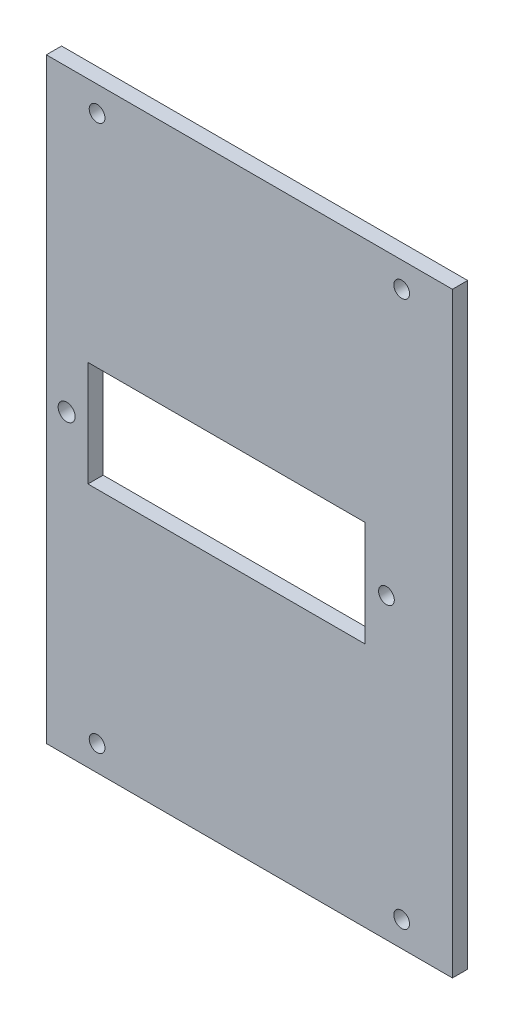
ISO-10303-21;
HEADER;
FILE_DESCRIPTION(('STEP AP214'),'2;1');
FILE_NAME('part.step','',(''),(''),'','','');
FILE_SCHEMA(('AUTOMOTIVE_DESIGN { 1 0 10303 214 1 1 1 1 }'));
ENDSEC;
DATA;
#1=APPLICATION_CONTEXT('core data for automotive mechanical design processes');
#2=APPLICATION_PROTOCOL_DEFINITION('international standard','automotive_design',2000,#1);
#3=PRODUCT_CONTEXT('',#1,'mechanical');
#4=PRODUCT('Part','Part','',(#3));
#5=PRODUCT_RELATED_PRODUCT_CATEGORY('part','',(#4));
#6=PRODUCT_DEFINITION_FORMATION('','',#4);
#7=PRODUCT_DEFINITION_CONTEXT('part definition',#1,'design');
#8=PRODUCT_DEFINITION('design','',#6,#7);
#9=PRODUCT_DEFINITION_SHAPE('','',#8);
#10=(LENGTH_UNIT() NAMED_UNIT(*) SI_UNIT(.MILLI.,.METRE.));
#11=(NAMED_UNIT(*) PLANE_ANGLE_UNIT() SI_UNIT($,.RADIAN.));
#12=(NAMED_UNIT(*) SI_UNIT($,.STERADIAN.) SOLID_ANGLE_UNIT());
#13=UNCERTAINTY_MEASURE_WITH_UNIT(LENGTH_MEASURE(1.E-05),#10,'distance_accuracy_value','');
#14=(GEOMETRIC_REPRESENTATION_CONTEXT(3) GLOBAL_UNCERTAINTY_ASSIGNED_CONTEXT((#13)) GLOBAL_UNIT_ASSIGNED_CONTEXT((#10,
#11,#12)) REPRESENTATION_CONTEXT('',''));
#15=CARTESIAN_POINT('',(0.,0.,0.));
#16=DIRECTION('',(0.,0.,1.));
#17=DIRECTION('',(1.,0.,0.));
#18=AXIS2_PLACEMENT_3D('',#15,#16,#17);
#19=CARTESIAN_POINT('',(0.,0.,3.));
#20=DIRECTION('',(0.,0.,-1.));
#21=DIRECTION('',(-1.,0.,0.));
#22=AXIS2_PLACEMENT_3D('',#19,#20,#21);
#23=PLANE('',#22);
#24=DIRECTION('',(1.,0.,0.));
#25=VECTOR('',#24,1.);
#26=CARTESIAN_POINT('',(17.193638584157,48.3784028769027,3.));
#27=LINE('',#26,#25);
#28=CARTESIAN_POINT('',(8.19363858415697,48.3784028769027,3.));
#29=VERTEX_POINT('',#28);
#30=CARTESIAN_POINT('',(62.806361415843,48.3784028769027,3.));
#31=VERTEX_POINT('',#30);
#32=EDGE_CURVE('E148',#29,#31,#27,.T.);
#33=ORIENTED_EDGE('',*,*,#32,.F.);
#34=DIRECTION('',(0.,-1.,0.));
#35=VECTOR('',#34,1.);
#36=CARTESIAN_POINT('',(8.19363858415697,69.1215971230973,3.));
#37=LINE('',#36,#35);
#38=CARTESIAN_POINT('',(8.19363858415697,69.1215971230973,3.));
#39=VERTEX_POINT('',#38);
#40=EDGE_CURVE('E135',#39,#29,#37,.T.);
#41=ORIENTED_EDGE('',*,*,#40,.F.);
#42=DIRECTION('',(-1.,0.,0.));
#43=VECTOR('',#42,1.);
#44=CARTESIAN_POINT('',(17.193638584157,69.1215971230973,3.));
#45=LINE('',#44,#43);
#46=CARTESIAN_POINT('',(62.806361415843,69.1215971230973,3.));
#47=VERTEX_POINT('',#46);
#48=EDGE_CURVE('E146',#47,#39,#45,.T.);
#49=ORIENTED_EDGE('',*,*,#48,.F.);
#50=DIRECTION('',(0.,1.,0.));
#51=VECTOR('',#50,1.);
#52=CARTESIAN_POINT('',(62.806361415843,69.1215971230973,3.));
#53=LINE('',#52,#51);
#54=EDGE_CURVE('E58',#31,#47,#53,.T.);
#55=ORIENTED_EDGE('',*,*,#54,.F.);
#56=EDGE_LOOP('',(#33,#41,#49,#55));
#57=FACE_BOUND('',#56,.T.);
#58=CARTESIAN_POINT('',(3.99999999999764,58.5762678494522,3.));
#59=DIRECTION('',(0.,0.,-1.));
#60=DIRECTION('',(-1.,0.,0.));
#61=AXIS2_PLACEMENT_3D('',#58,#59,#60);
#62=CIRCLE('',#61,1.6734068499753);
#63=CARTESIAN_POINT('',(2.32659315002234,58.5762678494522,3.));
#64=VERTEX_POINT('',#63);
#65=EDGE_CURVE('E156',#64,#64,#62,.T.);
#66=ORIENTED_EDGE('',*,*,#65,.T.);
#67=EDGE_LOOP('',(#66));
#68=FACE_BOUND('',#67,.T.);
#69=CARTESIAN_POINT('',(66.9999999999992,58.75,3.));
#70=DIRECTION('',(0.,0.,-1.));
#71=DIRECTION('',(-1.,0.,0.));
#72=AXIS2_PLACEMENT_3D('',#69,#70,#71);
#73=CIRCLE('',#72,1.55000000000001);
#74=CARTESIAN_POINT('',(65.4499999999992,58.75,3.));
#75=VERTEX_POINT('',#74);
#76=EDGE_CURVE('E162',#75,#75,#73,.F.);
#77=ORIENTED_EDGE('',*,*,#76,.F.);
#78=EDGE_LOOP('',(#77));
#79=FACE_BOUND('',#78,.T.);
#80=CARTESIAN_POINT('',(70.,4.99999999999998,3.));
#81=DIRECTION('',(0.,0.,1.));
#82=DIRECTION('',(1.,0.,0.));
#83=AXIS2_PLACEMENT_3D('',#80,#81,#82);
#84=CIRCLE('',#83,1.54999999999999);
#85=CARTESIAN_POINT('',(71.55,4.99999999999998,3.));
#86=VERTEX_POINT('',#85);
#87=EDGE_CURVE('E176',#86,#86,#84,.T.);
#88=ORIENTED_EDGE('',*,*,#87,.F.);
#89=EDGE_LOOP('',(#88));
#90=FACE_BOUND('',#89,.T.);
#91=CARTESIAN_POINT('',(9.99999999999997,112.5,3.));
#92=DIRECTION('',(0.,0.,1.));
#93=DIRECTION('',(1.,0.,0.));
#94=AXIS2_PLACEMENT_3D('',#91,#92,#93);
#95=CIRCLE('',#94,1.54999999999999);
#96=CARTESIAN_POINT('',(11.55,112.5,3.));
#97=VERTEX_POINT('',#96);
#98=EDGE_CURVE('E184',#97,#97,#95,.T.);
#99=ORIENTED_EDGE('',*,*,#98,.F.);
#100=EDGE_LOOP('',(#99));
#101=FACE_BOUND('',#100,.T.);
#102=DIRECTION('',(0.,-1.,0.));
#103=VECTOR('',#102,1.);
#104=CARTESIAN_POINT('',(0.,0.,3.));
#105=LINE('',#104,#103);
#106=CARTESIAN_POINT('',(0.,117.5,3.));
#107=VERTEX_POINT('',#106);
#108=CARTESIAN_POINT('',(0.,0.,3.));
#109=VERTEX_POINT('',#108);
#110=EDGE_CURVE('E190',#107,#109,#105,.T.);
#111=ORIENTED_EDGE('',*,*,#110,.T.);
#112=DIRECTION('',(1.,0.,0.));
#113=VECTOR('',#112,1.);
#114=CARTESIAN_POINT('',(0.,0.,3.));
#115=LINE('',#114,#113);
#116=CARTESIAN_POINT('',(80.,0.,3.));
#117=VERTEX_POINT('',#116);
#118=EDGE_CURVE('E96',#109,#117,#115,.T.);
#119=ORIENTED_EDGE('',*,*,#118,.T.);
#120=DIRECTION('',(0.,1.,0.));
#121=VECTOR('',#120,1.);
#122=CARTESIAN_POINT('',(80.,0.,3.));
#123=LINE('',#122,#121);
#124=CARTESIAN_POINT('',(80.,117.5,3.));
#125=VERTEX_POINT('',#124);
#126=EDGE_CURVE('E193',#117,#125,#123,.T.);
#127=ORIENTED_EDGE('',*,*,#126,.T.);
#128=DIRECTION('',(-1.,0.,0.));
#129=VECTOR('',#128,1.);
#130=CARTESIAN_POINT('',(0.,117.5,3.));
#131=LINE('',#130,#129);
#132=EDGE_CURVE('E67',#125,#107,#131,.T.);
#133=ORIENTED_EDGE('',*,*,#132,.T.);
#134=EDGE_LOOP('',(#111,#119,#127,#133));
#135=FACE_BOUND('',#134,.T.);
#136=CARTESIAN_POINT('',(70.,112.5,3.));
#137=DIRECTION('',(0.,0.,-1.));
#138=DIRECTION('',(-1.,0.,0.));
#139=AXIS2_PLACEMENT_3D('',#136,#137,#138);
#140=CIRCLE('',#139,1.54999999999999);
#141=CARTESIAN_POINT('',(71.55,112.5,3.));
#142=VERTEX_POINT('',#141);
#143=EDGE_CURVE('E169',#142,#142,#140,.T.);
#144=ORIENTED_EDGE('',*,*,#143,.T.);
#145=EDGE_LOOP('',(#144));
#146=FACE_BOUND('',#145,.T.);
#147=CARTESIAN_POINT('',(9.99999999999997,4.99999999999998,3.));
#148=DIRECTION('',(0.,0.,-1.));
#149=DIRECTION('',(-1.,0.,0.));
#150=AXIS2_PLACEMENT_3D('',#147,#148,#149);
#151=CIRCLE('',#150,1.55);
#152=CARTESIAN_POINT('',(11.55,4.99999999999998,3.));
#153=VERTEX_POINT('',#152);
#154=EDGE_CURVE('E179',#153,#153,#151,.T.);
#155=ORIENTED_EDGE('',*,*,#154,.T.);
#156=EDGE_LOOP('',(#155));
#157=FACE_BOUND('',#156,.T.);
#158=ADVANCED_FACE('F43',(#57,#68,#79,#90,#101,#135,#146,#157),#23,.F.);
#159=CARTESIAN_POINT('',(0.,0.,0.));
#160=DIRECTION('',(0.,0.,-1.));
#161=DIRECTION('',(-1.,0.,0.));
#162=AXIS2_PLACEMENT_3D('',#159,#160,#161);
#163=PLANE('',#162);
#164=DIRECTION('',(0.,1.,0.));
#165=VECTOR('',#164,1.);
#166=CARTESIAN_POINT('',(8.19363858415697,48.3784028769027,0.));
#167=LINE('',#166,#165);
#168=CARTESIAN_POINT('',(8.19363858415697,48.3784028769027,0.));
#169=VERTEX_POINT('',#168);
#170=CARTESIAN_POINT('',(8.19363858415697,69.1215971230973,0.));
#171=VERTEX_POINT('',#170);
#172=EDGE_CURVE('E133',#169,#171,#167,.T.);
#173=ORIENTED_EDGE('',*,*,#172,.F.);
#174=DIRECTION('',(-1.,0.,0.));
#175=VECTOR('',#174,1.);
#176=CARTESIAN_POINT('',(0.,48.3784028769027,0.));
#177=LINE('',#176,#175);
#178=CARTESIAN_POINT('',(62.806361415843,48.3784028769027,0.));
#179=VERTEX_POINT('',#178);
#180=EDGE_CURVE('E51',#179,#169,#177,.T.);
#181=ORIENTED_EDGE('',*,*,#180,.F.);
#182=DIRECTION('',(0.,-1.,0.));
#183=VECTOR('',#182,1.);
#184=CARTESIAN_POINT('',(62.806361415843,0.,0.));
#185=LINE('',#184,#183);
#186=CARTESIAN_POINT('',(62.806361415843,69.1215971230973,0.));
#187=VERTEX_POINT('',#186);
#188=EDGE_CURVE('E11',#187,#179,#185,.T.);
#189=ORIENTED_EDGE('',*,*,#188,.F.);
#190=DIRECTION('',(1.,0.,0.));
#191=VECTOR('',#190,1.);
#192=CARTESIAN_POINT('',(0.,69.1215971230973,0.));
#193=LINE('',#192,#191);
#194=EDGE_CURVE('E128',#171,#187,#193,.T.);
#195=ORIENTED_EDGE('',*,*,#194,.F.);
#196=EDGE_LOOP('',(#173,#181,#189,#195));
#197=FACE_BOUND('',#196,.T.);
#198=CARTESIAN_POINT('',(3.99999999999764,58.5762678494522,0.));
#199=DIRECTION('',(0.,0.,-1.));
#200=DIRECTION('',(-1.,0.,0.));
#201=AXIS2_PLACEMENT_3D('',#198,#199,#200);
#202=CIRCLE('',#201,1.6734068499753);
#203=CARTESIAN_POINT('',(2.32659315002234,58.5762678494522,0.));
#204=VERTEX_POINT('',#203);
#205=EDGE_CURVE('E152',#204,#204,#202,.T.);
#206=ORIENTED_EDGE('',*,*,#205,.F.);
#207=EDGE_LOOP('',(#206));
#208=FACE_BOUND('',#207,.T.);
#209=CARTESIAN_POINT('',(66.9999999999992,58.75,0.));
#210=DIRECTION('',(0.,0.,-1.));
#211=DIRECTION('',(-1.,0.,0.));
#212=AXIS2_PLACEMENT_3D('',#209,#210,#211);
#213=CIRCLE('',#212,1.55000000000001);
#214=CARTESIAN_POINT('',(65.4499999999992,58.75,0.));
#215=VERTEX_POINT('',#214);
#216=EDGE_CURVE('E159',#215,#215,#213,.T.);
#217=ORIENTED_EDGE('',*,*,#216,.F.);
#218=EDGE_LOOP('',(#217));
#219=FACE_BOUND('',#218,.T.);
#220=CARTESIAN_POINT('',(70.,112.5,0.));
#221=DIRECTION('',(0.,0.,-1.));
#222=DIRECTION('',(-1.,0.,0.));
#223=AXIS2_PLACEMENT_3D('',#220,#221,#222);
#224=CIRCLE('',#223,1.54999999999999);
#225=CARTESIAN_POINT('',(71.55,112.5,0.));
#226=VERTEX_POINT('',#225);
#227=EDGE_CURVE('E166',#226,#226,#224,.T.);
#228=ORIENTED_EDGE('',*,*,#227,.F.);
#229=EDGE_LOOP('',(#228));
#230=FACE_BOUND('',#229,.T.);
#231=CARTESIAN_POINT('',(9.99999999999997,112.5,0.));
#232=DIRECTION('',(0.,0.,-1.));
#233=DIRECTION('',(-1.,0.,0.));
#234=AXIS2_PLACEMENT_3D('',#231,#232,#233);
#235=CIRCLE('',#234,1.54999999999999);
#236=CARTESIAN_POINT('',(11.55,112.5,0.));
#237=VERTEX_POINT('',#236);
#238=EDGE_CURVE('E173',#237,#237,#235,.F.);
#239=ORIENTED_EDGE('',*,*,#238,.T.);
#240=EDGE_LOOP('',(#239));
#241=FACE_BOUND('',#240,.T.);
#242=DIRECTION('',(0.,-1.,0.));
#243=VECTOR('',#242,1.);
#244=CARTESIAN_POINT('',(0.,0.,0.));
#245=LINE('',#244,#243);
#246=CARTESIAN_POINT('',(0.,117.5,0.));
#247=VERTEX_POINT('',#246);
#248=CARTESIAN_POINT('',(0.,0.,0.));
#249=VERTEX_POINT('',#248);
#250=EDGE_CURVE('E187',#247,#249,#245,.T.);
#251=ORIENTED_EDGE('',*,*,#250,.F.);
#252=DIRECTION('',(-1.,0.,0.));
#253=VECTOR('',#252,1.);
#254=CARTESIAN_POINT('',(0.,117.5,0.));
#255=LINE('',#254,#253);
#256=CARTESIAN_POINT('',(80.,117.5,0.));
#257=VERTEX_POINT('',#256);
#258=EDGE_CURVE('E88',#257,#247,#255,.T.);
#259=ORIENTED_EDGE('',*,*,#258,.F.);
#260=DIRECTION('',(0.,1.,0.));
#261=VECTOR('',#260,1.);
#262=CARTESIAN_POINT('',(80.,0.,0.));
#263=LINE('',#262,#261);
#264=CARTESIAN_POINT('',(80.,0.,0.));
#265=VERTEX_POINT('',#264);
#266=EDGE_CURVE('E201',#265,#257,#263,.T.);
#267=ORIENTED_EDGE('',*,*,#266,.F.);
#268=DIRECTION('',(1.,0.,0.));
#269=VECTOR('',#268,1.);
#270=CARTESIAN_POINT('',(0.,0.,0.));
#271=LINE('',#270,#269);
#272=EDGE_CURVE('E199',#249,#265,#271,.T.);
#273=ORIENTED_EDGE('',*,*,#272,.F.);
#274=EDGE_LOOP('',(#251,#259,#267,#273));
#275=FACE_BOUND('',#274,.T.);
#276=CARTESIAN_POINT('',(70.,4.99999999999998,0.));
#277=DIRECTION('',(0.,0.,-1.));
#278=DIRECTION('',(-1.,0.,0.));
#279=AXIS2_PLACEMENT_3D('',#276,#277,#278);
#280=CIRCLE('',#279,1.54999999999999);
#281=CARTESIAN_POINT('',(71.55,4.99999999999998,0.));
#282=VERTEX_POINT('',#281);
#283=EDGE_CURVE('E170',#282,#282,#280,.F.);
#284=ORIENTED_EDGE('',*,*,#283,.T.);
#285=EDGE_LOOP('',(#284));
#286=FACE_BOUND('',#285,.T.);
#287=CARTESIAN_POINT('',(9.99999999999997,4.99999999999998,0.));
#288=DIRECTION('',(0.,0.,-1.));
#289=DIRECTION('',(-1.,0.,0.));
#290=AXIS2_PLACEMENT_3D('',#287,#288,#289);
#291=CIRCLE('',#290,1.55);
#292=CARTESIAN_POINT('',(11.55,4.99999999999998,0.));
#293=VERTEX_POINT('',#292);
#294=EDGE_CURVE('E165',#293,#293,#291,.T.);
#295=ORIENTED_EDGE('',*,*,#294,.F.);
#296=EDGE_LOOP('',(#295));
#297=FACE_BOUND('',#296,.T.);
#298=ADVANCED_FACE('F137',(#197,#208,#219,#230,#241,#275,#286,#297),#163,.T.);
#299=CARTESIAN_POINT('',(0.,0.,3.));
#300=DIRECTION('',(1.,0.,0.));
#301=DIRECTION('',(0.,1.,0.));
#302=AXIS2_PLACEMENT_3D('',#299,#300,#301);
#303=PLANE('',#302);
#304=ORIENTED_EDGE('',*,*,#250,.T.);
#305=DIRECTION('',(0.,0.,-1.));
#306=VECTOR('',#305,1.);
#307=CARTESIAN_POINT('',(0.,0.,3.));
#308=LINE('',#307,#306);
#309=EDGE_CURVE('E210',#109,#249,#308,.T.);
#310=ORIENTED_EDGE('',*,*,#309,.F.);
#311=ORIENTED_EDGE('',*,*,#110,.F.);
#312=DIRECTION('',(0.,0.,-1.));
#313=VECTOR('',#312,1.);
#314=CARTESIAN_POINT('',(0.,117.5,3.));
#315=LINE('',#314,#313);
#316=EDGE_CURVE('E196',#107,#247,#315,.T.);
#317=ORIENTED_EDGE('',*,*,#316,.T.);
#318=EDGE_LOOP('',(#304,#310,#311,#317));
#319=FACE_BOUND('',#318,.T.);
#320=ADVANCED_FACE('F45',(#319),#303,.F.);
#321=CARTESIAN_POINT('',(0.,0.,3.));
#322=DIRECTION('',(0.,1.,0.));
#323=DIRECTION('',(-1.,0.,0.));
#324=AXIS2_PLACEMENT_3D('',#321,#322,#323);
#325=PLANE('',#324);
#326=ORIENTED_EDGE('',*,*,#272,.T.);
#327=DIRECTION('',(0.,0.,-1.));
#328=VECTOR('',#327,1.);
#329=CARTESIAN_POINT('',(80.,0.,3.));
#330=LINE('',#329,#328);
#331=EDGE_CURVE('E207',#117,#265,#330,.T.);
#332=ORIENTED_EDGE('',*,*,#331,.F.);
#333=ORIENTED_EDGE('',*,*,#118,.F.);
#334=ORIENTED_EDGE('',*,*,#309,.T.);
#335=EDGE_LOOP('',(#326,#332,#333,#334));
#336=FACE_BOUND('',#335,.T.);
#337=ADVANCED_FACE('F263',(#336),#325,.F.);
#338=CARTESIAN_POINT('',(80.,0.,3.));
#339=DIRECTION('',(-1.,0.,0.));
#340=DIRECTION('',(0.,-1.,0.));
#341=AXIS2_PLACEMENT_3D('',#338,#339,#340);
#342=PLANE('',#341);
#343=ORIENTED_EDGE('',*,*,#266,.T.);
#344=DIRECTION('',(0.,0.,-1.));
#345=VECTOR('',#344,1.);
#346=CARTESIAN_POINT('',(80.,117.5,3.));
#347=LINE('',#346,#345);
#348=EDGE_CURVE('E205',#125,#257,#347,.T.);
#349=ORIENTED_EDGE('',*,*,#348,.F.);
#350=ORIENTED_EDGE('',*,*,#126,.F.);
#351=ORIENTED_EDGE('',*,*,#331,.T.);
#352=EDGE_LOOP('',(#343,#349,#350,#351));
#353=FACE_BOUND('',#352,.T.);
#354=ADVANCED_FACE('F261',(#353),#342,.F.);
#355=CARTESIAN_POINT('',(0.,117.5,3.));
#356=DIRECTION('',(0.,-1.,0.));
#357=DIRECTION('',(1.,0.,0.));
#358=AXIS2_PLACEMENT_3D('',#355,#356,#357);
#359=PLANE('',#358);
#360=ORIENTED_EDGE('',*,*,#258,.T.);
#361=ORIENTED_EDGE('',*,*,#316,.F.);
#362=ORIENTED_EDGE('',*,*,#132,.F.);
#363=ORIENTED_EDGE('',*,*,#348,.T.);
#364=EDGE_LOOP('',(#360,#361,#362,#363));
#365=FACE_BOUND('',#364,.T.);
#366=ADVANCED_FACE('F254',(#365),#359,.F.);
#367=CARTESIAN_POINT('',(9.99999999999997,112.5,-0.00100000000000013));
#368=DIRECTION('',(0.,0.,1.));
#369=DIRECTION('',(1.,0.,0.));
#370=AXIS2_PLACEMENT_3D('',#367,#368,#369);
#371=CYLINDRICAL_SURFACE('',#370,1.54999999999999);
#372=CARTESIAN_POINT('',(11.55,112.5,0.));
#373=CARTESIAN_POINT('',(11.55,112.5,0.03125));
#374=CARTESIAN_POINT('',(11.55,112.5,0.0625));
#375=CARTESIAN_POINT('',(11.55,112.5,0.125));
#376=CARTESIAN_POINT('',(11.55,112.5,0.15625));
#377=CARTESIAN_POINT('',(11.55,112.5,0.21875));
#378=CARTESIAN_POINT('',(11.55,112.5,0.25));
#379=CARTESIAN_POINT('',(11.55,112.5,0.3125));
#380=CARTESIAN_POINT('',(11.55,112.5,0.34375));
#381=CARTESIAN_POINT('',(11.55,112.5,0.40625));
#382=CARTESIAN_POINT('',(11.55,112.5,0.4375));
#383=CARTESIAN_POINT('',(11.55,112.5,0.5));
#384=CARTESIAN_POINT('',(11.55,112.5,0.53125));
#385=CARTESIAN_POINT('',(11.55,112.5,0.59375));
#386=CARTESIAN_POINT('',(11.55,112.5,0.625));
#387=CARTESIAN_POINT('',(11.55,112.5,0.6875));
#388=CARTESIAN_POINT('',(11.55,112.5,0.71875));
#389=CARTESIAN_POINT('',(11.55,112.5,0.78125));
#390=CARTESIAN_POINT('',(11.55,112.5,0.8125));
#391=CARTESIAN_POINT('',(11.55,112.5,0.875));
#392=CARTESIAN_POINT('',(11.55,112.5,0.90625));
#393=CARTESIAN_POINT('',(11.55,112.5,0.96875));
#394=CARTESIAN_POINT('',(11.55,112.5,1.));
#395=CARTESIAN_POINT('',(11.55,112.5,1.0625));
#396=CARTESIAN_POINT('',(11.55,112.5,1.09375));
#397=CARTESIAN_POINT('',(11.55,112.5,1.15625));
#398=CARTESIAN_POINT('',(11.55,112.5,1.1875));
#399=CARTESIAN_POINT('',(11.55,112.5,1.25));
#400=CARTESIAN_POINT('',(11.55,112.5,1.28125));
#401=CARTESIAN_POINT('',(11.55,112.5,1.34375));
#402=CARTESIAN_POINT('',(11.55,112.5,1.375));
#403=CARTESIAN_POINT('',(11.55,112.5,1.4375));
#404=CARTESIAN_POINT('',(11.55,112.5,1.46875));
#405=CARTESIAN_POINT('',(11.55,112.5,1.53125));
#406=CARTESIAN_POINT('',(11.55,112.5,1.5625));
#407=CARTESIAN_POINT('',(11.55,112.5,1.625));
#408=CARTESIAN_POINT('',(11.55,112.5,1.65625));
#409=CARTESIAN_POINT('',(11.55,112.5,1.71875));
#410=CARTESIAN_POINT('',(11.55,112.5,1.75));
#411=CARTESIAN_POINT('',(11.55,112.5,1.8125));
#412=CARTESIAN_POINT('',(11.55,112.5,1.84375));
#413=CARTESIAN_POINT('',(11.55,112.5,1.90625));
#414=CARTESIAN_POINT('',(11.55,112.5,1.9375));
#415=CARTESIAN_POINT('',(11.55,112.5,2.));
#416=CARTESIAN_POINT('',(11.55,112.5,2.03125));
#417=CARTESIAN_POINT('',(11.55,112.5,2.09375));
#418=CARTESIAN_POINT('',(11.55,112.5,2.125));
#419=CARTESIAN_POINT('',(11.55,112.5,2.1875));
#420=CARTESIAN_POINT('',(11.55,112.5,2.21875));
#421=CARTESIAN_POINT('',(11.55,112.5,2.28125));
#422=CARTESIAN_POINT('',(11.55,112.5,2.3125));
#423=CARTESIAN_POINT('',(11.55,112.5,2.375));
#424=CARTESIAN_POINT('',(11.55,112.5,2.40625));
#425=CARTESIAN_POINT('',(11.55,112.5,2.46875));
#426=CARTESIAN_POINT('',(11.55,112.5,2.5));
#427=CARTESIAN_POINT('',(11.55,112.5,2.5625));
#428=CARTESIAN_POINT('',(11.55,112.5,2.59375));
#429=CARTESIAN_POINT('',(11.55,112.5,2.65625));
#430=CARTESIAN_POINT('',(11.55,112.5,2.6875));
#431=CARTESIAN_POINT('',(11.55,112.5,2.75));
#432=CARTESIAN_POINT('',(11.55,112.5,2.78125));
#433=CARTESIAN_POINT('',(11.55,112.5,2.84375));
#434=CARTESIAN_POINT('',(11.55,112.5,2.875));
#435=CARTESIAN_POINT('',(11.55,112.5,2.9375));
#436=CARTESIAN_POINT('',(11.55,112.5,2.96875));
#437=CARTESIAN_POINT('',(11.55,112.5,3.));
#438=B_SPLINE_CURVE_WITH_KNOTS('',3,(#372,#373,#374,#375,#376,#377,#378,#379,#380,#381,#382,
#383,#384,#385,#386,#387,#388,#389,#390,#391,#392,#393,#394,#395,#396,#397,#398,#399,#400,#401,
#402,#403,#404,#405,#406,#407,#408,#409,#410,#411,#412,#413,#414,#415,#416,#417,#418,#419,#420,
#421,#422,#423,#424,#425,#426,#427,#428,#429,#430,#431,#432,#433,#434,#435,#436,#437),
.UNSPECIFIED.,.F.,.F.,(4,2,2,2,2,2,2,2,2,2,2,2,2,2,2,2,2,2,2,2,2,2,2,2,2,2,2,2,2,2,2,2,4),(0.,
0.09375,0.1875,0.28125,0.375,0.46875,0.5625,0.65625,0.75,0.84375,0.9375,1.03125,1.125,1.21875,
1.3125,1.40625,1.5,1.59375,1.6875,1.78125,1.875,1.96875,2.0625,2.15625,2.25,2.34375,2.4375,
2.53125,2.625,2.71875,2.8125,2.90625,3.),.UNSPECIFIED.);
#439=EDGE_CURVE('BSEAM252',#237,#97,#438,.T.);
#440=ORIENTED_EDGE('',*,*,#238,.F.);
#441=ORIENTED_EDGE('',*,*,#98,.T.);
#442=ORIENTED_EDGE('',*,*,#439,.T.);
#443=ORIENTED_EDGE('',*,*,#439,.F.);
#444=EDGE_LOOP('',(#440,#442,#441,#443));
#445=FACE_BOUND('',#444,.T.);
#446=ADVANCED_FACE('F252',(#445),#371,.F.);
#447=CARTESIAN_POINT('',(70.,112.5,-0.00100000000000013));
#448=DIRECTION('',(0.,0.,1.));
#449=DIRECTION('',(1.,0.,0.));
#450=AXIS2_PLACEMENT_3D('',#447,#448,#449);
#451=CYLINDRICAL_SURFACE('',#450,1.54999999999999);
#452=CARTESIAN_POINT('',(71.55,112.5,0.));
#453=CARTESIAN_POINT('',(71.55,112.5,0.03125));
#454=CARTESIAN_POINT('',(71.55,112.5,0.0625));
#455=CARTESIAN_POINT('',(71.55,112.5,0.125));
#456=CARTESIAN_POINT('',(71.55,112.5,0.15625));
#457=CARTESIAN_POINT('',(71.55,112.5,0.21875));
#458=CARTESIAN_POINT('',(71.55,112.5,0.25));
#459=CARTESIAN_POINT('',(71.55,112.5,0.3125));
#460=CARTESIAN_POINT('',(71.55,112.5,0.34375));
#461=CARTESIAN_POINT('',(71.55,112.5,0.40625));
#462=CARTESIAN_POINT('',(71.55,112.5,0.4375));
#463=CARTESIAN_POINT('',(71.55,112.5,0.5));
#464=CARTESIAN_POINT('',(71.55,112.5,0.53125));
#465=CARTESIAN_POINT('',(71.55,112.5,0.59375));
#466=CARTESIAN_POINT('',(71.55,112.5,0.625));
#467=CARTESIAN_POINT('',(71.55,112.5,0.6875));
#468=CARTESIAN_POINT('',(71.55,112.5,0.71875));
#469=CARTESIAN_POINT('',(71.55,112.5,0.78125));
#470=CARTESIAN_POINT('',(71.55,112.5,0.8125));
#471=CARTESIAN_POINT('',(71.55,112.5,0.875));
#472=CARTESIAN_POINT('',(71.55,112.5,0.90625));
#473=CARTESIAN_POINT('',(71.55,112.5,0.96875));
#474=CARTESIAN_POINT('',(71.55,112.5,1.));
#475=CARTESIAN_POINT('',(71.55,112.5,1.0625));
#476=CARTESIAN_POINT('',(71.55,112.5,1.09375));
#477=CARTESIAN_POINT('',(71.55,112.5,1.15625));
#478=CARTESIAN_POINT('',(71.55,112.5,1.1875));
#479=CARTESIAN_POINT('',(71.55,112.5,1.25));
#480=CARTESIAN_POINT('',(71.55,112.5,1.28125));
#481=CARTESIAN_POINT('',(71.55,112.5,1.34375));
#482=CARTESIAN_POINT('',(71.55,112.5,1.375));
#483=CARTESIAN_POINT('',(71.55,112.5,1.4375));
#484=CARTESIAN_POINT('',(71.55,112.5,1.46875));
#485=CARTESIAN_POINT('',(71.55,112.5,1.53125));
#486=CARTESIAN_POINT('',(71.55,112.5,1.5625));
#487=CARTESIAN_POINT('',(71.55,112.5,1.625));
#488=CARTESIAN_POINT('',(71.55,112.5,1.65625));
#489=CARTESIAN_POINT('',(71.55,112.5,1.71875));
#490=CARTESIAN_POINT('',(71.55,112.5,1.75));
#491=CARTESIAN_POINT('',(71.55,112.5,1.8125));
#492=CARTESIAN_POINT('',(71.55,112.5,1.84375));
#493=CARTESIAN_POINT('',(71.55,112.5,1.90625));
#494=CARTESIAN_POINT('',(71.55,112.5,1.9375));
#495=CARTESIAN_POINT('',(71.55,112.5,2.));
#496=CARTESIAN_POINT('',(71.55,112.5,2.03125));
#497=CARTESIAN_POINT('',(71.55,112.5,2.09375));
#498=CARTESIAN_POINT('',(71.55,112.5,2.125));
#499=CARTESIAN_POINT('',(71.55,112.5,2.1875));
#500=CARTESIAN_POINT('',(71.55,112.5,2.21875));
#501=CARTESIAN_POINT('',(71.55,112.5,2.28125));
#502=CARTESIAN_POINT('',(71.55,112.5,2.3125));
#503=CARTESIAN_POINT('',(71.55,112.5,2.375));
#504=CARTESIAN_POINT('',(71.55,112.5,2.40625));
#505=CARTESIAN_POINT('',(71.55,112.5,2.46875));
#506=CARTESIAN_POINT('',(71.55,112.5,2.5));
#507=CARTESIAN_POINT('',(71.55,112.5,2.5625));
#508=CARTESIAN_POINT('',(71.55,112.5,2.59375));
#509=CARTESIAN_POINT('',(71.55,112.5,2.65625));
#510=CARTESIAN_POINT('',(71.55,112.5,2.6875));
#511=CARTESIAN_POINT('',(71.55,112.5,2.75));
#512=CARTESIAN_POINT('',(71.55,112.5,2.78125));
#513=CARTESIAN_POINT('',(71.55,112.5,2.84375));
#514=CARTESIAN_POINT('',(71.55,112.5,2.875));
#515=CARTESIAN_POINT('',(71.55,112.5,2.9375));
#516=CARTESIAN_POINT('',(71.55,112.5,2.96875));
#517=CARTESIAN_POINT('',(71.55,112.5,3.));
#518=B_SPLINE_CURVE_WITH_KNOTS('',3,(#452,#453,#454,#455,#456,#457,#458,#459,#460,#461,#462,
#463,#464,#465,#466,#467,#468,#469,#470,#471,#472,#473,#474,#475,#476,#477,#478,#479,#480,#481,
#482,#483,#484,#485,#486,#487,#488,#489,#490,#491,#492,#493,#494,#495,#496,#497,#498,#499,#500,
#501,#502,#503,#504,#505,#506,#507,#508,#509,#510,#511,#512,#513,#514,#515,#516,#517),
.UNSPECIFIED.,.F.,.F.,(4,2,2,2,2,2,2,2,2,2,2,2,2,2,2,2,2,2,2,2,2,2,2,2,2,2,2,2,2,2,2,2,4),(0.,
0.09375,0.1875,0.28125,0.375,0.46875,0.5625,0.65625,0.75,0.84375,0.9375,1.03125,1.125,1.21875,
1.3125,1.40625,1.5,1.59375,1.6875,1.78125,1.875,1.96875,2.0625,2.15625,2.25,2.34375,2.4375,
2.53125,2.625,2.71875,2.8125,2.90625,3.),.UNSPECIFIED.);
#519=EDGE_CURVE('BSEAM247',#226,#142,#518,.T.);
#520=ORIENTED_EDGE('',*,*,#227,.T.);
#521=ORIENTED_EDGE('',*,*,#143,.F.);
#522=ORIENTED_EDGE('',*,*,#519,.T.);
#523=ORIENTED_EDGE('',*,*,#519,.F.);
#524=EDGE_LOOP('',(#520,#522,#521,#523));
#525=FACE_BOUND('',#524,.T.);
#526=ADVANCED_FACE('F247',(#525),#451,.F.);
#527=CARTESIAN_POINT('',(70.,4.99999999999998,-0.00100000000000013));
#528=DIRECTION('',(0.,0.,1.));
#529=DIRECTION('',(1.,0.,0.));
#530=AXIS2_PLACEMENT_3D('',#527,#528,#529);
#531=CYLINDRICAL_SURFACE('',#530,1.54999999999999);
#532=CARTESIAN_POINT('',(71.55,4.99999999999998,0.));
#533=CARTESIAN_POINT('',(71.55,4.99999999999998,0.03125));
#534=CARTESIAN_POINT('',(71.55,4.99999999999998,0.0625));
#535=CARTESIAN_POINT('',(71.55,4.99999999999998,0.125));
#536=CARTESIAN_POINT('',(71.55,4.99999999999998,0.15625));
#537=CARTESIAN_POINT('',(71.55,4.99999999999998,0.21875));
#538=CARTESIAN_POINT('',(71.55,4.99999999999998,0.25));
#539=CARTESIAN_POINT('',(71.55,4.99999999999998,0.3125));
#540=CARTESIAN_POINT('',(71.55,4.99999999999998,0.34375));
#541=CARTESIAN_POINT('',(71.55,4.99999999999998,0.40625));
#542=CARTESIAN_POINT('',(71.55,4.99999999999998,0.4375));
#543=CARTESIAN_POINT('',(71.55,4.99999999999998,0.5));
#544=CARTESIAN_POINT('',(71.55,4.99999999999998,0.53125));
#545=CARTESIAN_POINT('',(71.55,4.99999999999998,0.59375));
#546=CARTESIAN_POINT('',(71.55,4.99999999999998,0.625));
#547=CARTESIAN_POINT('',(71.55,4.99999999999998,0.6875));
#548=CARTESIAN_POINT('',(71.55,4.99999999999998,0.71875));
#549=CARTESIAN_POINT('',(71.55,4.99999999999998,0.78125));
#550=CARTESIAN_POINT('',(71.55,4.99999999999998,0.8125));
#551=CARTESIAN_POINT('',(71.55,4.99999999999998,0.875));
#552=CARTESIAN_POINT('',(71.55,4.99999999999998,0.90625));
#553=CARTESIAN_POINT('',(71.55,4.99999999999998,0.96875));
#554=CARTESIAN_POINT('',(71.55,4.99999999999998,1.));
#555=CARTESIAN_POINT('',(71.55,4.99999999999998,1.0625));
#556=CARTESIAN_POINT('',(71.55,4.99999999999998,1.09375));
#557=CARTESIAN_POINT('',(71.55,4.99999999999998,1.15625));
#558=CARTESIAN_POINT('',(71.55,4.99999999999998,1.1875));
#559=CARTESIAN_POINT('',(71.55,4.99999999999998,1.25));
#560=CARTESIAN_POINT('',(71.55,4.99999999999998,1.28125));
#561=CARTESIAN_POINT('',(71.55,4.99999999999998,1.34375));
#562=CARTESIAN_POINT('',(71.55,4.99999999999998,1.375));
#563=CARTESIAN_POINT('',(71.55,4.99999999999998,1.4375));
#564=CARTESIAN_POINT('',(71.55,4.99999999999998,1.46875));
#565=CARTESIAN_POINT('',(71.55,4.99999999999998,1.53125));
#566=CARTESIAN_POINT('',(71.55,4.99999999999998,1.5625));
#567=CARTESIAN_POINT('',(71.55,4.99999999999998,1.625));
#568=CARTESIAN_POINT('',(71.55,4.99999999999998,1.65625));
#569=CARTESIAN_POINT('',(71.55,4.99999999999998,1.71875));
#570=CARTESIAN_POINT('',(71.55,4.99999999999998,1.75));
#571=CARTESIAN_POINT('',(71.55,4.99999999999998,1.8125));
#572=CARTESIAN_POINT('',(71.55,4.99999999999998,1.84375));
#573=CARTESIAN_POINT('',(71.55,4.99999999999998,1.90625));
#574=CARTESIAN_POINT('',(71.55,4.99999999999998,1.9375));
#575=CARTESIAN_POINT('',(71.55,4.99999999999998,2.));
#576=CARTESIAN_POINT('',(71.55,4.99999999999998,2.03125));
#577=CARTESIAN_POINT('',(71.55,4.99999999999998,2.09375));
#578=CARTESIAN_POINT('',(71.55,4.99999999999998,2.125));
#579=CARTESIAN_POINT('',(71.55,4.99999999999998,2.1875));
#580=CARTESIAN_POINT('',(71.55,4.99999999999998,2.21875));
#581=CARTESIAN_POINT('',(71.55,4.99999999999998,2.28125));
#582=CARTESIAN_POINT('',(71.55,4.99999999999998,2.3125));
#583=CARTESIAN_POINT('',(71.55,4.99999999999998,2.375));
#584=CARTESIAN_POINT('',(71.55,4.99999999999998,2.40625));
#585=CARTESIAN_POINT('',(71.55,4.99999999999998,2.46875));
#586=CARTESIAN_POINT('',(71.55,4.99999999999998,2.5));
#587=CARTESIAN_POINT('',(71.55,4.99999999999998,2.5625));
#588=CARTESIAN_POINT('',(71.55,4.99999999999998,2.59375));
#589=CARTESIAN_POINT('',(71.55,4.99999999999998,2.65625));
#590=CARTESIAN_POINT('',(71.55,4.99999999999998,2.6875));
#591=CARTESIAN_POINT('',(71.55,4.99999999999998,2.75));
#592=CARTESIAN_POINT('',(71.55,4.99999999999998,2.78125));
#593=CARTESIAN_POINT('',(71.55,4.99999999999998,2.84375));
#594=CARTESIAN_POINT('',(71.55,4.99999999999998,2.875));
#595=CARTESIAN_POINT('',(71.55,4.99999999999998,2.9375));
#596=CARTESIAN_POINT('',(71.55,4.99999999999998,2.96875));
#597=CARTESIAN_POINT('',(71.55,4.99999999999998,3.));
#598=B_SPLINE_CURVE_WITH_KNOTS('',3,(#532,#533,#534,#535,#536,#537,#538,#539,#540,#541,#542,
#543,#544,#545,#546,#547,#548,#549,#550,#551,#552,#553,#554,#555,#556,#557,#558,#559,#560,#561,
#562,#563,#564,#565,#566,#567,#568,#569,#570,#571,#572,#573,#574,#575,#576,#577,#578,#579,#580,
#581,#582,#583,#584,#585,#586,#587,#588,#589,#590,#591,#592,#593,#594,#595,#596,#597),
.UNSPECIFIED.,.F.,.F.,(4,2,2,2,2,2,2,2,2,2,2,2,2,2,2,2,2,2,2,2,2,2,2,2,2,2,2,2,2,2,2,2,4),(0.,
0.09375,0.1875,0.28125,0.375,0.46875,0.5625,0.65625,0.75,0.84375,0.9375,1.03125,1.125,1.21875,
1.3125,1.40625,1.5,1.59375,1.6875,1.78125,1.875,1.96875,2.0625,2.15625,2.25,2.34375,2.4375,
2.53125,2.625,2.71875,2.8125,2.90625,3.),.UNSPECIFIED.);
#599=EDGE_CURVE('BSEAM237',#282,#86,#598,.T.);
#600=ORIENTED_EDGE('',*,*,#283,.F.);
#601=ORIENTED_EDGE('',*,*,#87,.T.);
#602=ORIENTED_EDGE('',*,*,#599,.T.);
#603=ORIENTED_EDGE('',*,*,#599,.F.);
#604=EDGE_LOOP('',(#600,#602,#601,#603));
#605=FACE_BOUND('',#604,.T.);
#606=ADVANCED_FACE('F237',(#605),#531,.F.);
#607=CARTESIAN_POINT('',(9.99999999999997,4.99999999999998,-0.00100000000000013));
#608=DIRECTION('',(0.,0.,1.));
#609=DIRECTION('',(1.,0.,0.));
#610=AXIS2_PLACEMENT_3D('',#607,#608,#609);
#611=CYLINDRICAL_SURFACE('',#610,1.55);
#612=CARTESIAN_POINT('',(11.55,4.99999999999998,0.));
#613=CARTESIAN_POINT('',(11.55,4.99999999999998,0.03125));
#614=CARTESIAN_POINT('',(11.55,4.99999999999998,0.0625));
#615=CARTESIAN_POINT('',(11.55,4.99999999999998,0.125));
#616=CARTESIAN_POINT('',(11.55,4.99999999999998,0.15625));
#617=CARTESIAN_POINT('',(11.55,4.99999999999998,0.21875));
#618=CARTESIAN_POINT('',(11.55,4.99999999999998,0.25));
#619=CARTESIAN_POINT('',(11.55,4.99999999999998,0.3125));
#620=CARTESIAN_POINT('',(11.55,4.99999999999998,0.34375));
#621=CARTESIAN_POINT('',(11.55,4.99999999999998,0.40625));
#622=CARTESIAN_POINT('',(11.55,4.99999999999998,0.4375));
#623=CARTESIAN_POINT('',(11.55,4.99999999999998,0.5));
#624=CARTESIAN_POINT('',(11.55,4.99999999999998,0.53125));
#625=CARTESIAN_POINT('',(11.55,4.99999999999998,0.59375));
#626=CARTESIAN_POINT('',(11.55,4.99999999999998,0.625));
#627=CARTESIAN_POINT('',(11.55,4.99999999999998,0.6875));
#628=CARTESIAN_POINT('',(11.55,4.99999999999998,0.71875));
#629=CARTESIAN_POINT('',(11.55,4.99999999999998,0.78125));
#630=CARTESIAN_POINT('',(11.55,4.99999999999998,0.8125));
#631=CARTESIAN_POINT('',(11.55,4.99999999999998,0.875));
#632=CARTESIAN_POINT('',(11.55,4.99999999999998,0.90625));
#633=CARTESIAN_POINT('',(11.55,4.99999999999998,0.96875));
#634=CARTESIAN_POINT('',(11.55,4.99999999999998,1.));
#635=CARTESIAN_POINT('',(11.55,4.99999999999998,1.0625));
#636=CARTESIAN_POINT('',(11.55,4.99999999999998,1.09375));
#637=CARTESIAN_POINT('',(11.55,4.99999999999998,1.15625));
#638=CARTESIAN_POINT('',(11.55,4.99999999999998,1.1875));
#639=CARTESIAN_POINT('',(11.55,4.99999999999998,1.25));
#640=CARTESIAN_POINT('',(11.55,4.99999999999998,1.28125));
#641=CARTESIAN_POINT('',(11.55,4.99999999999998,1.34375));
#642=CARTESIAN_POINT('',(11.55,4.99999999999998,1.375));
#643=CARTESIAN_POINT('',(11.55,4.99999999999998,1.4375));
#644=CARTESIAN_POINT('',(11.55,4.99999999999998,1.46875));
#645=CARTESIAN_POINT('',(11.55,4.99999999999998,1.53125));
#646=CARTESIAN_POINT('',(11.55,4.99999999999998,1.5625));
#647=CARTESIAN_POINT('',(11.55,4.99999999999998,1.625));
#648=CARTESIAN_POINT('',(11.55,4.99999999999998,1.65625));
#649=CARTESIAN_POINT('',(11.55,4.99999999999998,1.71875));
#650=CARTESIAN_POINT('',(11.55,4.99999999999998,1.75));
#651=CARTESIAN_POINT('',(11.55,4.99999999999998,1.8125));
#652=CARTESIAN_POINT('',(11.55,4.99999999999998,1.84375));
#653=CARTESIAN_POINT('',(11.55,4.99999999999998,1.90625));
#654=CARTESIAN_POINT('',(11.55,4.99999999999998,1.9375));
#655=CARTESIAN_POINT('',(11.55,4.99999999999998,2.));
#656=CARTESIAN_POINT('',(11.55,4.99999999999998,2.03125));
#657=CARTESIAN_POINT('',(11.55,4.99999999999998,2.09375));
#658=CARTESIAN_POINT('',(11.55,4.99999999999998,2.125));
#659=CARTESIAN_POINT('',(11.55,4.99999999999998,2.1875));
#660=CARTESIAN_POINT('',(11.55,4.99999999999998,2.21875));
#661=CARTESIAN_POINT('',(11.55,4.99999999999998,2.28125));
#662=CARTESIAN_POINT('',(11.55,4.99999999999998,2.3125));
#663=CARTESIAN_POINT('',(11.55,4.99999999999998,2.375));
#664=CARTESIAN_POINT('',(11.55,4.99999999999998,2.40625));
#665=CARTESIAN_POINT('',(11.55,4.99999999999998,2.46875));
#666=CARTESIAN_POINT('',(11.55,4.99999999999998,2.5));
#667=CARTESIAN_POINT('',(11.55,4.99999999999998,2.5625));
#668=CARTESIAN_POINT('',(11.55,4.99999999999998,2.59375));
#669=CARTESIAN_POINT('',(11.55,4.99999999999998,2.65625));
#670=CARTESIAN_POINT('',(11.55,4.99999999999998,2.6875));
#671=CARTESIAN_POINT('',(11.55,4.99999999999998,2.75));
#672=CARTESIAN_POINT('',(11.55,4.99999999999998,2.78125));
#673=CARTESIAN_POINT('',(11.55,4.99999999999998,2.84375));
#674=CARTESIAN_POINT('',(11.55,4.99999999999998,2.875));
#675=CARTESIAN_POINT('',(11.55,4.99999999999998,2.9375));
#676=CARTESIAN_POINT('',(11.55,4.99999999999998,2.96875));
#677=CARTESIAN_POINT('',(11.55,4.99999999999998,3.));
#678=B_SPLINE_CURVE_WITH_KNOTS('',3,(#612,#613,#614,#615,#616,#617,#618,#619,#620,#621,#622,
#623,#624,#625,#626,#627,#628,#629,#630,#631,#632,#633,#634,#635,#636,#637,#638,#639,#640,#641,
#642,#643,#644,#645,#646,#647,#648,#649,#650,#651,#652,#653,#654,#655,#656,#657,#658,#659,#660,
#661,#662,#663,#664,#665,#666,#667,#668,#669,#670,#671,#672,#673,#674,#675,#676,#677),
.UNSPECIFIED.,.F.,.F.,(4,2,2,2,2,2,2,2,2,2,2,2,2,2,2,2,2,2,2,2,2,2,2,2,2,2,2,2,2,2,2,2,4),(0.,
0.09375,0.1875,0.28125,0.375,0.46875,0.5625,0.65625,0.75,0.84375,0.9375,1.03125,1.125,1.21875,
1.3125,1.40625,1.5,1.59375,1.6875,1.78125,1.875,1.96875,2.0625,2.15625,2.25,2.34375,2.4375,
2.53125,2.625,2.71875,2.8125,2.90625,3.),.UNSPECIFIED.);
#679=EDGE_CURVE('BSEAM234',#293,#153,#678,.T.);
#680=ORIENTED_EDGE('',*,*,#294,.T.);
#681=ORIENTED_EDGE('',*,*,#154,.F.);
#682=ORIENTED_EDGE('',*,*,#679,.T.);
#683=ORIENTED_EDGE('',*,*,#679,.F.);
#684=EDGE_LOOP('',(#680,#682,#681,#683));
#685=FACE_BOUND('',#684,.T.);
#686=ADVANCED_FACE('F234',(#685),#611,.F.);
#687=CARTESIAN_POINT('',(66.9999999999992,58.75,3.001));
#688=DIRECTION('',(0.,0.,-1.));
#689=DIRECTION('',(-1.,0.,0.));
#690=AXIS2_PLACEMENT_3D('',#687,#688,#689);
#691=CYLINDRICAL_SURFACE('',#690,1.55000000000001);
#692=CARTESIAN_POINT('',(65.4499999999992,58.75,0.));
#693=CARTESIAN_POINT('',(65.4499999999992,58.75,0.0312500000000005));
#694=CARTESIAN_POINT('',(65.4499999999992,58.75,0.0625000000000005));
#695=CARTESIAN_POINT('',(65.4499999999992,58.75,0.125000000000001));
#696=CARTESIAN_POINT('',(65.4499999999992,58.75,0.156250000000001));
#697=CARTESIAN_POINT('',(65.4499999999992,58.75,0.218750000000001));
#698=CARTESIAN_POINT('',(65.4499999999992,58.75,0.250000000000001));
#699=CARTESIAN_POINT('',(65.4499999999992,58.75,0.312500000000001));
#700=CARTESIAN_POINT('',(65.4499999999992,58.75,0.34375));
#701=CARTESIAN_POINT('',(65.4499999999992,58.75,0.40625));
#702=CARTESIAN_POINT('',(65.4499999999992,58.75,0.4375));
#703=CARTESIAN_POINT('',(65.4499999999992,58.75,0.5));
#704=CARTESIAN_POINT('',(65.4499999999992,58.75,0.53125));
#705=CARTESIAN_POINT('',(65.4499999999992,58.75,0.593750000000001));
#706=CARTESIAN_POINT('',(65.4499999999992,58.75,0.625000000000001));
#707=CARTESIAN_POINT('',(65.4499999999992,58.75,0.687500000000001));
#708=CARTESIAN_POINT('',(65.4499999999992,58.75,0.71875));
#709=CARTESIAN_POINT('',(65.4499999999992,58.75,0.78125));
#710=CARTESIAN_POINT('',(65.4499999999992,58.75,0.8125));
#711=CARTESIAN_POINT('',(65.4499999999992,58.75,0.875));
#712=CARTESIAN_POINT('',(65.4499999999992,58.75,0.90625));
#713=CARTESIAN_POINT('',(65.4499999999992,58.75,0.96875));
#714=CARTESIAN_POINT('',(65.4499999999992,58.75,1.));
#715=CARTESIAN_POINT('',(65.4499999999992,58.75,1.0625));
#716=CARTESIAN_POINT('',(65.4499999999992,58.75,1.09375));
#717=CARTESIAN_POINT('',(65.4499999999992,58.75,1.15625));
#718=CARTESIAN_POINT('',(65.4499999999992,58.75,1.1875));
#719=CARTESIAN_POINT('',(65.4499999999992,58.75,1.25));
#720=CARTESIAN_POINT('',(65.4499999999992,58.75,1.28125));
#721=CARTESIAN_POINT('',(65.4499999999992,58.75,1.34375));
#722=CARTESIAN_POINT('',(65.4499999999992,58.75,1.375));
#723=CARTESIAN_POINT('',(65.4499999999992,58.75,1.4375));
#724=CARTESIAN_POINT('',(65.4499999999992,58.75,1.46875));
#725=CARTESIAN_POINT('',(65.4499999999992,58.75,1.53125));
#726=CARTESIAN_POINT('',(65.4499999999992,58.75,1.5625));
#727=CARTESIAN_POINT('',(65.4499999999992,58.75,1.625));
#728=CARTESIAN_POINT('',(65.4499999999992,58.75,1.65625));
#729=CARTESIAN_POINT('',(65.4499999999992,58.75,1.71875));
#730=CARTESIAN_POINT('',(65.4499999999992,58.75,1.75));
#731=CARTESIAN_POINT('',(65.4499999999992,58.75,1.8125));
#732=CARTESIAN_POINT('',(65.4499999999992,58.75,1.84375));
#733=CARTESIAN_POINT('',(65.4499999999992,58.75,1.90625));
#734=CARTESIAN_POINT('',(65.4499999999992,58.75,1.9375));
#735=CARTESIAN_POINT('',(65.4499999999992,58.75,2.));
#736=CARTESIAN_POINT('',(65.4499999999992,58.75,2.03125));
#737=CARTESIAN_POINT('',(65.4499999999992,58.75,2.09375));
#738=CARTESIAN_POINT('',(65.4499999999992,58.75,2.125));
#739=CARTESIAN_POINT('',(65.4499999999992,58.75,2.1875));
#740=CARTESIAN_POINT('',(65.4499999999992,58.75,2.21875));
#741=CARTESIAN_POINT('',(65.4499999999992,58.75,2.28125));
#742=CARTESIAN_POINT('',(65.4499999999992,58.75,2.3125));
#743=CARTESIAN_POINT('',(65.4499999999992,58.75,2.375));
#744=CARTESIAN_POINT('',(65.4499999999992,58.75,2.40625));
#745=CARTESIAN_POINT('',(65.4499999999992,58.75,2.46875));
#746=CARTESIAN_POINT('',(65.4499999999992,58.75,2.5));
#747=CARTESIAN_POINT('',(65.4499999999992,58.75,2.5625));
#748=CARTESIAN_POINT('',(65.4499999999992,58.75,2.59375));
#749=CARTESIAN_POINT('',(65.4499999999992,58.75,2.65625));
#750=CARTESIAN_POINT('',(65.4499999999992,58.75,2.6875));
#751=CARTESIAN_POINT('',(65.4499999999992,58.75,2.75));
#752=CARTESIAN_POINT('',(65.4499999999992,58.75,2.78125));
#753=CARTESIAN_POINT('',(65.4499999999992,58.75,2.84375));
#754=CARTESIAN_POINT('',(65.4499999999992,58.75,2.875));
#755=CARTESIAN_POINT('',(65.4499999999992,58.75,2.9375));
#756=CARTESIAN_POINT('',(65.4499999999992,58.75,2.96875));
#757=CARTESIAN_POINT('',(65.4499999999992,58.75,3.));
#758=B_SPLINE_CURVE_WITH_KNOTS('',3,(#692,#693,#694,#695,#696,#697,#698,#699,#700,#701,#702,
#703,#704,#705,#706,#707,#708,#709,#710,#711,#712,#713,#714,#715,#716,#717,#718,#719,#720,#721,
#722,#723,#724,#725,#726,#727,#728,#729,#730,#731,#732,#733,#734,#735,#736,#737,#738,#739,#740,
#741,#742,#743,#744,#745,#746,#747,#748,#749,#750,#751,#752,#753,#754,#755,#756,#757),
.UNSPECIFIED.,.F.,.F.,(4,2,2,2,2,2,2,2,2,2,2,2,2,2,2,2,2,2,2,2,2,2,2,2,2,2,2,2,2,2,2,2,4),(0.,
0.0937500000000001,0.1875,0.28125,0.375,0.46875,0.5625,0.65625,0.75,0.84375,0.9375,1.03125,
1.125,1.21875,1.3125,1.40625,1.5,1.59375,1.6875,1.78125,1.875,1.96875,2.0625,2.15625,2.25,
2.34375,2.4375,2.53125,2.625,2.71875,2.8125,2.90625,3.),.UNSPECIFIED.);
#759=EDGE_CURVE('BSEAM236',#215,#75,#758,.T.);
#760=ORIENTED_EDGE('',*,*,#216,.T.);
#761=ORIENTED_EDGE('',*,*,#76,.T.);
#762=ORIENTED_EDGE('',*,*,#759,.T.);
#763=ORIENTED_EDGE('',*,*,#759,.F.);
#764=EDGE_LOOP('',(#760,#762,#761,#763));
#765=FACE_BOUND('',#764,.T.);
#766=ADVANCED_FACE('F236',(#765),#691,.F.);
#767=CARTESIAN_POINT('',(3.99999999999764,58.5762678494522,10.));
#768=DIRECTION('',(0.,0.,-1.));
#769=DIRECTION('',(-1.,0.,0.));
#770=AXIS2_PLACEMENT_3D('',#767,#768,#769);
#771=CYLINDRICAL_SURFACE('',#770,1.6734068499753);
#772=ORIENTED_EDGE('',*,*,#205,.T.);
#773=EDGE_LOOP('',(#772));
#774=FACE_BOUND('',#773,.T.);
#775=ORIENTED_EDGE('',*,*,#65,.F.);
#776=EDGE_LOOP('',(#775));
#777=FACE_BOUND('',#776,.T.);
#778=ADVANCED_FACE('F244',(#774,#777),#771,.F.);
#779=CARTESIAN_POINT('',(62.806361415843,69.1215971230973,-7.));
#780=DIRECTION('',(1.,0.,0.));
#781=DIRECTION('',(0.,0.,-1.));
#782=AXIS2_PLACEMENT_3D('',#779,#780,#781);
#783=PLANE('',#782);
#784=ORIENTED_EDGE('',*,*,#188,.T.);
#785=DIRECTION('',(0.,0.,1.));
#786=VECTOR('',#785,1.);
#787=CARTESIAN_POINT('',(62.806361415843,48.3784028769027,-7.));
#788=LINE('',#787,#786);
#789=EDGE_CURVE('E124',#179,#31,#788,.T.);
#790=ORIENTED_EDGE('',*,*,#789,.T.);
#791=ORIENTED_EDGE('',*,*,#54,.T.);
#792=DIRECTION('',(0.,0.,1.));
#793=VECTOR('',#792,1.);
#794=CARTESIAN_POINT('',(62.806361415843,69.1215971230973,-7.));
#795=LINE('',#794,#793);
#796=EDGE_CURVE('E150',#187,#47,#795,.T.);
#797=ORIENTED_EDGE('',*,*,#796,.F.);
#798=EDGE_LOOP('',(#784,#790,#791,#797));
#799=FACE_BOUND('',#798,.T.);
#800=ADVANCED_FACE('F215',(#799),#783,.F.);
#801=CARTESIAN_POINT('',(17.193638584157,48.3784028769027,-7.));
#802=DIRECTION('',(0.,-1.,0.));
#803=DIRECTION('',(0.,0.,-1.));
#804=AXIS2_PLACEMENT_3D('',#801,#802,#803);
#805=PLANE('',#804);
#806=ORIENTED_EDGE('',*,*,#180,.T.);
#807=DIRECTION('',(0.,0.,-1.));
#808=VECTOR('',#807,1.);
#809=CARTESIAN_POINT('',(8.19363858415697,48.3784028769027,3.));
#810=LINE('',#809,#808);
#811=EDGE_CURVE('E122',#29,#169,#810,.T.);
#812=ORIENTED_EDGE('',*,*,#811,.F.);
#813=ORIENTED_EDGE('',*,*,#32,.T.);
#814=ORIENTED_EDGE('',*,*,#789,.F.);
#815=EDGE_LOOP('',(#806,#812,#813,#814));
#816=FACE_BOUND('',#815,.T.);
#817=ADVANCED_FACE('F120',(#816),#805,.F.);
#818=CARTESIAN_POINT('',(17.193638584157,69.1215971230973,-7.));
#819=DIRECTION('',(0.,1.,0.));
#820=DIRECTION('',(0.,0.,1.));
#821=AXIS2_PLACEMENT_3D('',#818,#819,#820);
#822=PLANE('',#821);
#823=ORIENTED_EDGE('',*,*,#194,.T.);
#824=ORIENTED_EDGE('',*,*,#796,.T.);
#825=ORIENTED_EDGE('',*,*,#48,.T.);
#826=DIRECTION('',(0.,0.,1.));
#827=VECTOR('',#826,1.);
#828=CARTESIAN_POINT('',(8.19363858415697,69.1215971230973,0.));
#829=LINE('',#828,#827);
#830=EDGE_CURVE('E140',#171,#39,#829,.T.);
#831=ORIENTED_EDGE('',*,*,#830,.F.);
#832=EDGE_LOOP('',(#823,#824,#825,#831));
#833=FACE_BOUND('',#832,.T.);
#834=ADVANCED_FACE('F213',(#833),#822,.F.);
#835=CARTESIAN_POINT('',(8.19363858415697,0.,0.));
#836=DIRECTION('',(1.,0.,0.));
#837=DIRECTION('',(0.,0.,-1.));
#838=AXIS2_PLACEMENT_3D('',#835,#836,#837);
#839=PLANE('',#838);
#840=ORIENTED_EDGE('',*,*,#811,.T.);
#841=ORIENTED_EDGE('',*,*,#172,.T.);
#842=ORIENTED_EDGE('',*,*,#830,.T.);
#843=ORIENTED_EDGE('',*,*,#40,.T.);
#844=EDGE_LOOP('',(#840,#841,#842,#843));
#845=FACE_BOUND('',#844,.T.);
#846=ADVANCED_FACE('F131',(#845),#839,.T.);
#847=CLOSED_SHELL('',(#158,#298,#320,#337,#354,#366,#446,#526,#606,#686,#766,#778,#800,#817,
#834,#846));
#848=MANIFOLD_SOLID_BREP('B2',#847);
#849=ADVANCED_BREP_SHAPE_REPRESENTATION('',(#18,#848),#14);
#850=SHAPE_DEFINITION_REPRESENTATION(#9,#849);
ENDSEC;
END-ISO-10303-21;
